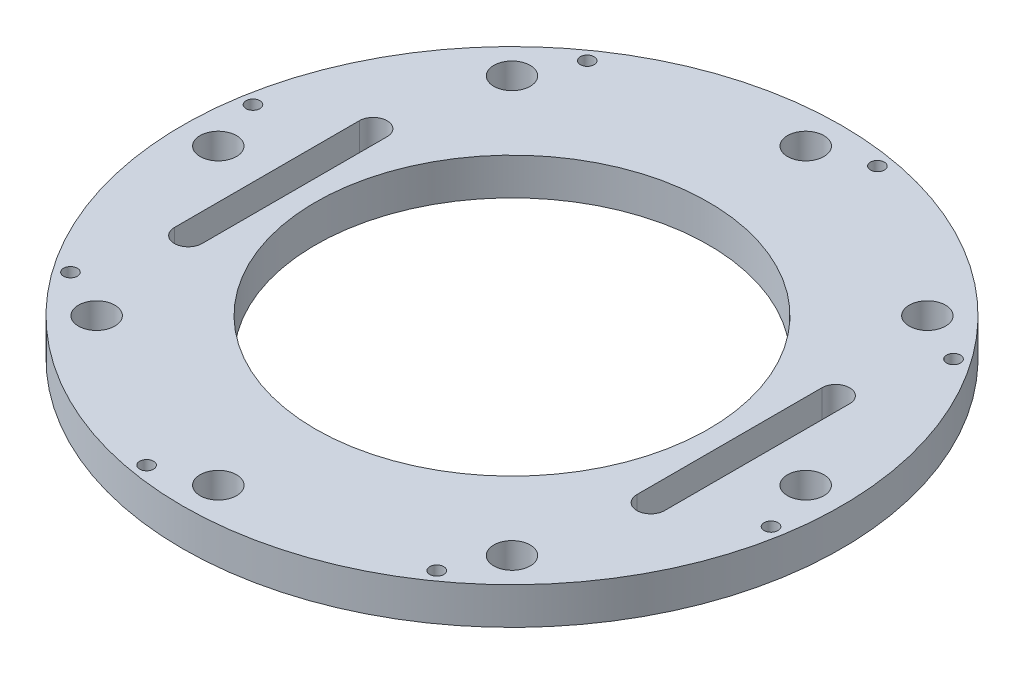
ISO-10303-21;
HEADER;
FILE_DESCRIPTION(('STEP AP214'),'2;1');
FILE_NAME('part.step','',(''),(''),'','','');
FILE_SCHEMA(('AUTOMOTIVE_DESIGN { 1 0 10303 214 1 1 1 1 }'));
ENDSEC;
DATA;
#1=APPLICATION_CONTEXT('core data for automotive mechanical design processes');
#2=APPLICATION_PROTOCOL_DEFINITION('international standard','automotive_design',2000,#1);
#3=PRODUCT_CONTEXT('',#1,'mechanical');
#4=PRODUCT('Part','Part','',(#3));
#5=PRODUCT_RELATED_PRODUCT_CATEGORY('part','',(#4));
#6=PRODUCT_DEFINITION_FORMATION('','',#4);
#7=PRODUCT_DEFINITION_CONTEXT('part definition',#1,'design');
#8=PRODUCT_DEFINITION('design','',#6,#7);
#9=PRODUCT_DEFINITION_SHAPE('','',#8);
#10=(LENGTH_UNIT() NAMED_UNIT(*) SI_UNIT(.MILLI.,.METRE.));
#11=(NAMED_UNIT(*) PLANE_ANGLE_UNIT() SI_UNIT($,.RADIAN.));
#12=(NAMED_UNIT(*) SI_UNIT($,.STERADIAN.) SOLID_ANGLE_UNIT());
#13=UNCERTAINTY_MEASURE_WITH_UNIT(LENGTH_MEASURE(1.E-05),#10,'distance_accuracy_value','');
#14=(GEOMETRIC_REPRESENTATION_CONTEXT(3) GLOBAL_UNCERTAINTY_ASSIGNED_CONTEXT((#13)) GLOBAL_UNIT_ASSIGNED_CONTEXT((#10,
#11,#12)) REPRESENTATION_CONTEXT('',''));
#15=CARTESIAN_POINT('',(0.,0.,0.));
#16=DIRECTION('',(0.,0.,1.));
#17=DIRECTION('',(1.,0.,0.));
#18=AXIS2_PLACEMENT_3D('',#15,#16,#17);
#19=CARTESIAN_POINT('',(-10.6,1.6,0.));
#20=DIRECTION('',(-1.,0.,0.));
#21=DIRECTION('',(0.,0.,1.));
#22=AXIS2_PLACEMENT_3D('',#19,#20,#21);
#23=PLANE('',#22);
#24=DIRECTION('',(0.,0.,-1.));
#25=VECTOR('',#24,1.);
#26=CARTESIAN_POINT('',(-10.6,0.,0.));
#27=LINE('',#26,#25);
#28=CARTESIAN_POINT('',(-10.6,0.,4.));
#29=VERTEX_POINT('',#28);
#30=CARTESIAN_POINT('',(-10.6,0.,-4.));
#31=VERTEX_POINT('',#30);
#32=EDGE_CURVE('E195',#29,#31,#27,.T.);
#33=ORIENTED_EDGE('',*,*,#32,.T.);
#34=DIRECTION('',(0.,-1.,0.));
#35=VECTOR('',#34,1.);
#36=CARTESIAN_POINT('',(-10.6,1.6,-4.));
#37=LINE('',#36,#35);
#38=CARTESIAN_POINT('',(-10.6,1.6,-4.));
#39=VERTEX_POINT('',#38);
#40=EDGE_CURVE('E11',#39,#31,#37,.T.);
#41=ORIENTED_EDGE('',*,*,#40,.F.);
#42=DIRECTION('',(0.,0.,-1.));
#43=VECTOR('',#42,1.);
#44=CARTESIAN_POINT('',(-10.6,1.6,0.));
#45=LINE('',#44,#43);
#46=CARTESIAN_POINT('',(-10.6,1.6,4.));
#47=VERTEX_POINT('',#46);
#48=EDGE_CURVE('E112',#47,#39,#45,.T.);
#49=ORIENTED_EDGE('',*,*,#48,.F.);
#50=DIRECTION('',(0.,-1.,0.));
#51=VECTOR('',#50,1.);
#52=CARTESIAN_POINT('',(-10.6,1.6,4.));
#53=LINE('',#52,#51);
#54=EDGE_CURVE('E203',#47,#29,#53,.T.);
#55=ORIENTED_EDGE('',*,*,#54,.T.);
#56=EDGE_LOOP('',(#33,#41,#49,#55));
#57=FACE_BOUND('',#56,.T.);
#58=ADVANCED_FACE('F35',(#57),#23,.F.);
#59=CARTESIAN_POINT('',(-10.,1.6,-4.));
#60=DIRECTION('',(0.,-1.,0.));
#61=DIRECTION('',(0.,0.,-1.));
#62=AXIS2_PLACEMENT_3D('',#59,#60,#61);
#63=CYLINDRICAL_SURFACE('',#62,0.6);
#64=CARTESIAN_POINT('',(-10.,0.,-4.));
#65=DIRECTION('',(0.,1.,0.));
#66=DIRECTION('',(0.,0.,1.));
#67=AXIS2_PLACEMENT_3D('',#64,#65,#66);
#68=CIRCLE('',#67,0.6);
#69=CARTESIAN_POINT('',(-9.4,0.,-4.));
#70=VERTEX_POINT('',#69);
#71=EDGE_CURVE('E118',#31,#70,#68,.F.);
#72=ORIENTED_EDGE('',*,*,#71,.T.);
#73=DIRECTION('',(0.,-1.,0.));
#74=VECTOR('',#73,1.);
#75=CARTESIAN_POINT('',(-9.4,1.6,-4.));
#76=LINE('',#75,#74);
#77=CARTESIAN_POINT('',(-9.4,1.6,-4.));
#78=VERTEX_POINT('',#77);
#79=EDGE_CURVE('E45',#78,#70,#76,.T.);
#80=ORIENTED_EDGE('',*,*,#79,.F.);
#81=CARTESIAN_POINT('',(-10.,1.6,-4.));
#82=DIRECTION('',(0.,1.,0.));
#83=DIRECTION('',(0.,0.,1.));
#84=AXIS2_PLACEMENT_3D('',#81,#82,#83);
#85=CIRCLE('',#84,0.6);
#86=EDGE_CURVE('E106',#39,#78,#85,.F.);
#87=ORIENTED_EDGE('',*,*,#86,.F.);
#88=ORIENTED_EDGE('',*,*,#40,.T.);
#89=EDGE_LOOP('',(#72,#80,#87,#88));
#90=FACE_BOUND('',#89,.T.);
#91=ADVANCED_FACE('F117',(#90),#63,.F.);
#92=CARTESIAN_POINT('',(-9.4,1.6,0.));
#93=DIRECTION('',(-1.,0.,0.));
#94=DIRECTION('',(0.,0.,1.));
#95=AXIS2_PLACEMENT_3D('',#92,#93,#94);
#96=PLANE('',#95);
#97=DIRECTION('',(0.,0.,-1.));
#98=VECTOR('',#97,1.);
#99=CARTESIAN_POINT('',(-9.4,0.,0.));
#100=LINE('',#99,#98);
#101=CARTESIAN_POINT('',(-9.4,0.,4.));
#102=VERTEX_POINT('',#101);
#103=EDGE_CURVE('E199',#102,#70,#100,.T.);
#104=ORIENTED_EDGE('',*,*,#103,.F.);
#105=DIRECTION('',(0.,-1.,0.));
#106=VECTOR('',#105,1.);
#107=CARTESIAN_POINT('',(-9.4,1.6,4.));
#108=LINE('',#107,#106);
#109=CARTESIAN_POINT('',(-9.4,1.6,4.));
#110=VERTEX_POINT('',#109);
#111=EDGE_CURVE('E82',#110,#102,#108,.T.);
#112=ORIENTED_EDGE('',*,*,#111,.F.);
#113=DIRECTION('',(0.,0.,-1.));
#114=VECTOR('',#113,1.);
#115=CARTESIAN_POINT('',(-9.4,1.6,0.));
#116=LINE('',#115,#114);
#117=EDGE_CURVE('E110',#110,#78,#116,.T.);
#118=ORIENTED_EDGE('',*,*,#117,.T.);
#119=ORIENTED_EDGE('',*,*,#79,.T.);
#120=EDGE_LOOP('',(#104,#112,#118,#119));
#121=FACE_BOUND('',#120,.T.);
#122=ADVANCED_FACE('F123',(#121),#96,.T.);
#123=CARTESIAN_POINT('',(10.,1.6,-4.));
#124=DIRECTION('',(0.,-1.,0.));
#125=DIRECTION('',(0.,0.,-1.));
#126=AXIS2_PLACEMENT_3D('',#123,#124,#125);
#127=CYLINDRICAL_SURFACE('',#126,0.6);
#128=CARTESIAN_POINT('',(10.,0.,-4.));
#129=DIRECTION('',(0.,1.,0.));
#130=DIRECTION('',(0.,0.,1.));
#131=AXIS2_PLACEMENT_3D('',#128,#129,#130);
#132=CIRCLE('',#131,0.6);
#133=CARTESIAN_POINT('',(10.6,0.,-4.));
#134=VERTEX_POINT('',#133);
#135=CARTESIAN_POINT('',(9.4,0.,-4.));
#136=VERTEX_POINT('',#135);
#137=EDGE_CURVE('E177',#134,#136,#132,.T.);
#138=ORIENTED_EDGE('',*,*,#137,.F.);
#139=DIRECTION('',(0.,-1.,0.));
#140=VECTOR('',#139,1.);
#141=CARTESIAN_POINT('',(10.6,1.6,-4.));
#142=LINE('',#141,#140);
#143=CARTESIAN_POINT('',(10.6,1.6,-4.));
#144=VERTEX_POINT('',#143);
#145=EDGE_CURVE('E39',#144,#134,#142,.T.);
#146=ORIENTED_EDGE('',*,*,#145,.F.);
#147=CARTESIAN_POINT('',(10.,1.6,-4.));
#148=DIRECTION('',(0.,1.,0.));
#149=DIRECTION('',(0.,0.,1.));
#150=AXIS2_PLACEMENT_3D('',#147,#148,#149);
#151=CIRCLE('',#150,0.6);
#152=CARTESIAN_POINT('',(9.4,1.6,-4.));
#153=VERTEX_POINT('',#152);
#154=EDGE_CURVE('E236',#144,#153,#151,.T.);
#155=ORIENTED_EDGE('',*,*,#154,.T.);
#156=DIRECTION('',(0.,-1.,0.));
#157=VECTOR('',#156,1.);
#158=CARTESIAN_POINT('',(9.4,1.6,-4.));
#159=LINE('',#158,#157);
#160=EDGE_CURVE('E125',#153,#136,#159,.T.);
#161=ORIENTED_EDGE('',*,*,#160,.T.);
#162=EDGE_LOOP('',(#138,#146,#155,#161));
#163=FACE_BOUND('',#162,.T.);
#164=ADVANCED_FACE('F218',(#163),#127,.F.);
#165=CARTESIAN_POINT('',(10.6,1.6,0.));
#166=DIRECTION('',(-1.,0.,0.));
#167=DIRECTION('',(0.,0.,1.));
#168=AXIS2_PLACEMENT_3D('',#165,#166,#167);
#169=PLANE('',#168);
#170=DIRECTION('',(0.,0.,-1.));
#171=VECTOR('',#170,1.);
#172=CARTESIAN_POINT('',(10.6,0.,0.));
#173=LINE('',#172,#171);
#174=CARTESIAN_POINT('',(10.6,0.,4.));
#175=VERTEX_POINT('',#174);
#176=EDGE_CURVE('E180',#175,#134,#173,.T.);
#177=ORIENTED_EDGE('',*,*,#176,.F.);
#178=DIRECTION('',(0.,-1.,0.));
#179=VECTOR('',#178,1.);
#180=CARTESIAN_POINT('',(10.6,1.6,4.));
#181=LINE('',#180,#179);
#182=CARTESIAN_POINT('',(10.6,1.6,4.));
#183=VERTEX_POINT('',#182);
#184=EDGE_CURVE('E208',#183,#175,#181,.T.);
#185=ORIENTED_EDGE('',*,*,#184,.F.);
#186=DIRECTION('',(0.,0.,-1.));
#187=VECTOR('',#186,1.);
#188=CARTESIAN_POINT('',(10.6,1.6,0.));
#189=LINE('',#188,#187);
#190=EDGE_CURVE('E217',#183,#144,#189,.T.);
#191=ORIENTED_EDGE('',*,*,#190,.T.);
#192=ORIENTED_EDGE('',*,*,#145,.T.);
#193=EDGE_LOOP('',(#177,#185,#191,#192));
#194=FACE_BOUND('',#193,.T.);
#195=ADVANCED_FACE('F215',(#194),#169,.T.);
#196=CARTESIAN_POINT('',(10.,1.6,4.));
#197=DIRECTION('',(0.,-1.,0.));
#198=DIRECTION('',(0.,0.,-1.));
#199=AXIS2_PLACEMENT_3D('',#196,#197,#198);
#200=CYLINDRICAL_SURFACE('',#199,0.6);
#201=CARTESIAN_POINT('',(10.,0.,4.));
#202=DIRECTION('',(0.,1.,0.));
#203=DIRECTION('',(0.,0.,1.));
#204=AXIS2_PLACEMENT_3D('',#201,#202,#203);
#205=CIRCLE('',#204,0.6);
#206=CARTESIAN_POINT('',(9.4,0.,4.));
#207=VERTEX_POINT('',#206);
#208=EDGE_CURVE('E183',#207,#175,#205,.T.);
#209=ORIENTED_EDGE('',*,*,#208,.F.);
#210=DIRECTION('',(0.,-1.,0.));
#211=VECTOR('',#210,1.);
#212=CARTESIAN_POINT('',(9.4,1.6,4.));
#213=LINE('',#212,#211);
#214=CARTESIAN_POINT('',(9.4,1.6,4.));
#215=VERTEX_POINT('',#214);
#216=EDGE_CURVE('E207',#215,#207,#213,.T.);
#217=ORIENTED_EDGE('',*,*,#216,.F.);
#218=CARTESIAN_POINT('',(10.,1.6,4.));
#219=DIRECTION('',(0.,1.,0.));
#220=DIRECTION('',(0.,0.,1.));
#221=AXIS2_PLACEMENT_3D('',#218,#219,#220);
#222=CIRCLE('',#221,0.6);
#223=EDGE_CURVE('E227',#215,#183,#222,.T.);
#224=ORIENTED_EDGE('',*,*,#223,.T.);
#225=ORIENTED_EDGE('',*,*,#184,.T.);
#226=EDGE_LOOP('',(#209,#217,#224,#225));
#227=FACE_BOUND('',#226,.T.);
#228=ADVANCED_FACE('F224',(#227),#200,.F.);
#229=CARTESIAN_POINT('',(0.,1.6,0.));
#230=DIRECTION('',(0.,-1.,0.));
#231=DIRECTION('',(0.,0.,-1.));
#232=AXIS2_PLACEMENT_3D('',#229,#230,#231);
#233=CYLINDRICAL_SURFACE('',#232,14.25);
#234=CARTESIAN_POINT('',(0.,1.6,0.));
#235=DIRECTION('',(0.,1.,0.));
#236=DIRECTION('',(0.,0.,1.));
#237=AXIS2_PLACEMENT_3D('',#234,#235,#236);
#238=CIRCLE('',#237,14.25);
#239=CARTESIAN_POINT('',(0.,1.6,14.25));
#240=VERTEX_POINT('',#239);
#241=EDGE_CURVE('E242',#240,#240,#238,.T.);
#242=ORIENTED_EDGE('',*,*,#241,.F.);
#243=EDGE_LOOP('',(#242));
#244=FACE_BOUND('',#243,.T.);
#245=CARTESIAN_POINT('',(0.,0.,0.));
#246=DIRECTION('',(0.,1.,0.));
#247=DIRECTION('',(0.,0.,1.));
#248=AXIS2_PLACEMENT_3D('',#245,#246,#247);
#249=CIRCLE('',#248,14.25);
#250=CARTESIAN_POINT('',(0.,0.,14.25));
#251=VERTEX_POINT('',#250);
#252=EDGE_CURVE('E192',#251,#251,#249,.T.);
#253=ORIENTED_EDGE('',*,*,#252,.T.);
#254=EDGE_LOOP('',(#253));
#255=FACE_BOUND('',#254,.T.);
#256=ADVANCED_FACE('F247',(#244,#255),#233,.T.);
#257=CARTESIAN_POINT('',(0.,1.6,0.));
#258=DIRECTION('',(0.,-1.,0.));
#259=DIRECTION('',(0.,0.,-1.));
#260=AXIS2_PLACEMENT_3D('',#257,#258,#259);
#261=CYLINDRICAL_SURFACE('',#260,8.5);
#262=CARTESIAN_POINT('',(0.,1.6,0.));
#263=DIRECTION('',(0.,1.,0.));
#264=DIRECTION('',(0.,0.,1.));
#265=AXIS2_PLACEMENT_3D('',#262,#263,#264);
#266=CIRCLE('',#265,8.5);
#267=CARTESIAN_POINT('',(0.,1.6,8.5));
#268=VERTEX_POINT('',#267);
#269=EDGE_CURVE('E232',#268,#268,#266,.T.);
#270=ORIENTED_EDGE('',*,*,#269,.T.);
#271=EDGE_LOOP('',(#270));
#272=FACE_BOUND('',#271,.T.);
#273=CARTESIAN_POINT('',(0.,0.,0.));
#274=DIRECTION('',(0.,1.,0.));
#275=DIRECTION('',(0.,0.,1.));
#276=AXIS2_PLACEMENT_3D('',#273,#274,#275);
#277=CIRCLE('',#276,8.5);
#278=CARTESIAN_POINT('',(0.,0.,8.5));
#279=VERTEX_POINT('',#278);
#280=EDGE_CURVE('E189',#279,#279,#277,.T.);
#281=ORIENTED_EDGE('',*,*,#280,.F.);
#282=EDGE_LOOP('',(#281));
#283=FACE_BOUND('',#282,.T.);
#284=ADVANCED_FACE('F250',(#272,#283),#261,.F.);
#285=CARTESIAN_POINT('',(9.4,1.6,0.));
#286=DIRECTION('',(-1.,0.,0.));
#287=DIRECTION('',(0.,0.,1.));
#288=AXIS2_PLACEMENT_3D('',#285,#286,#287);
#289=PLANE('',#288);
#290=DIRECTION('',(0.,0.,-1.));
#291=VECTOR('',#290,1.);
#292=CARTESIAN_POINT('',(9.4,0.,0.));
#293=LINE('',#292,#291);
#294=EDGE_CURVE('E186',#207,#136,#293,.T.);
#295=ORIENTED_EDGE('',*,*,#294,.T.);
#296=ORIENTED_EDGE('',*,*,#160,.F.);
#297=DIRECTION('',(0.,0.,-1.));
#298=VECTOR('',#297,1.);
#299=CARTESIAN_POINT('',(9.4,1.6,0.));
#300=LINE('',#299,#298);
#301=EDGE_CURVE('E229',#215,#153,#300,.T.);
#302=ORIENTED_EDGE('',*,*,#301,.F.);
#303=ORIENTED_EDGE('',*,*,#216,.T.);
#304=EDGE_LOOP('',(#295,#296,#302,#303));
#305=FACE_BOUND('',#304,.T.);
#306=ADVANCED_FACE('F230',(#305),#289,.F.);
#307=CARTESIAN_POINT('',(-8.98025612106917,1.6,8.98025612106914));
#308=DIRECTION('',(0.,-1.,0.));
#309=DIRECTION('',(0.,0.,-1.));
#310=AXIS2_PLACEMENT_3D('',#307,#308,#309);
#311=CYLINDRICAL_SURFACE('',#310,0.7874);
#312=CARTESIAN_POINT('',(-8.98025612106917,1.6,8.98025612106914));
#313=DIRECTION('',(0.,1.,0.));
#314=DIRECTION('',(0.,0.,1.));
#315=AXIS2_PLACEMENT_3D('',#312,#313,#314);
#316=CIRCLE('',#315,0.7874);
#317=CARTESIAN_POINT('',(-8.98025612106917,1.6,9.76765612106914));
#318=VERTEX_POINT('',#317);
#319=EDGE_CURVE('E441',#318,#318,#316,.T.);
#320=ORIENTED_EDGE('',*,*,#319,.T.);
#321=EDGE_LOOP('',(#320));
#322=FACE_BOUND('',#321,.T.);
#323=CARTESIAN_POINT('',(-8.98025612106917,0.,8.98025612106914));
#324=DIRECTION('',(0.,1.,0.));
#325=DIRECTION('',(0.,0.,1.));
#326=AXIS2_PLACEMENT_3D('',#323,#324,#325);
#327=CIRCLE('',#326,0.7874);
#328=CARTESIAN_POINT('',(-8.98025612106917,0.,9.76765612106914));
#329=VERTEX_POINT('',#328);
#330=EDGE_CURVE('E174',#329,#329,#327,.T.);
#331=ORIENTED_EDGE('',*,*,#330,.F.);
#332=EDGE_LOOP('',(#331));
#333=FACE_BOUND('',#332,.T.);
#334=ADVANCED_FACE('F284',(#322,#333),#311,.F.);
#335=CARTESIAN_POINT('',(-12.7,1.6,0.));
#336=DIRECTION('',(0.,-1.,0.));
#337=DIRECTION('',(0.,0.,-1.));
#338=AXIS2_PLACEMENT_3D('',#335,#336,#337);
#339=CYLINDRICAL_SURFACE('',#338,0.787399999999999);
#340=CARTESIAN_POINT('',(-12.7,1.6,0.));
#341=DIRECTION('',(0.,1.,0.));
#342=DIRECTION('',(0.,0.,1.));
#343=AXIS2_PLACEMENT_3D('',#340,#341,#342);
#344=CIRCLE('',#343,0.787399999999999);
#345=CARTESIAN_POINT('',(-12.7,1.6,0.787399999999955));
#346=VERTEX_POINT('',#345);
#347=EDGE_CURVE('E438',#346,#346,#344,.T.);
#348=ORIENTED_EDGE('',*,*,#347,.T.);
#349=EDGE_LOOP('',(#348));
#350=FACE_BOUND('',#349,.T.);
#351=CARTESIAN_POINT('',(-12.7,0.,0.));
#352=DIRECTION('',(0.,1.,0.));
#353=DIRECTION('',(0.,0.,1.));
#354=AXIS2_PLACEMENT_3D('',#351,#352,#353);
#355=CIRCLE('',#354,0.787399999999999);
#356=CARTESIAN_POINT('',(-12.7,0.,0.787399999999955));
#357=VERTEX_POINT('',#356);
#358=EDGE_CURVE('E171',#357,#357,#355,.T.);
#359=ORIENTED_EDGE('',*,*,#358,.F.);
#360=EDGE_LOOP('',(#359));
#361=FACE_BOUND('',#360,.T.);
#362=ADVANCED_FACE('F293',(#350,#361),#339,.F.);
#363=CARTESIAN_POINT('',(-8.98025612106911,1.6,-8.9802561210692));
#364=DIRECTION('',(0.,-1.,0.));
#365=DIRECTION('',(0.,0.,-1.));
#366=AXIS2_PLACEMENT_3D('',#363,#364,#365);
#367=CYLINDRICAL_SURFACE('',#366,0.7874);
#368=CARTESIAN_POINT('',(-8.98025612106911,1.6,-8.9802561210692));
#369=DIRECTION('',(0.,1.,0.));
#370=DIRECTION('',(0.,0.,1.));
#371=AXIS2_PLACEMENT_3D('',#368,#369,#370);
#372=CIRCLE('',#371,0.7874);
#373=CARTESIAN_POINT('',(-8.98025612106911,1.6,-8.1928561210692));
#374=VERTEX_POINT('',#373);
#375=EDGE_CURVE('E435',#374,#374,#372,.T.);
#376=ORIENTED_EDGE('',*,*,#375,.T.);
#377=EDGE_LOOP('',(#376));
#378=FACE_BOUND('',#377,.T.);
#379=CARTESIAN_POINT('',(-8.98025612106911,0.,-8.9802561210692));
#380=DIRECTION('',(0.,1.,0.));
#381=DIRECTION('',(0.,0.,1.));
#382=AXIS2_PLACEMENT_3D('',#379,#380,#381);
#383=CIRCLE('',#382,0.7874);
#384=CARTESIAN_POINT('',(-8.98025612106911,0.,-8.1928561210692));
#385=VERTEX_POINT('',#384);
#386=EDGE_CURVE('E168',#385,#385,#383,.T.);
#387=ORIENTED_EDGE('',*,*,#386,.F.);
#388=EDGE_LOOP('',(#387));
#389=FACE_BOUND('',#388,.T.);
#390=ADVANCED_FACE('F297',(#378,#389),#367,.F.);
#391=CARTESIAN_POINT('',(0.,1.6,-12.7));
#392=DIRECTION('',(0.,-1.,0.));
#393=DIRECTION('',(0.,0.,-1.));
#394=AXIS2_PLACEMENT_3D('',#391,#392,#393);
#395=CYLINDRICAL_SURFACE('',#394,0.7874);
#396=CARTESIAN_POINT('',(0.,1.6,-12.7));
#397=DIRECTION('',(0.,1.,0.));
#398=DIRECTION('',(0.,0.,1.));
#399=AXIS2_PLACEMENT_3D('',#396,#397,#398);
#400=CIRCLE('',#399,0.7874);
#401=CARTESIAN_POINT('',(0.,1.6,-11.9126));
#402=VERTEX_POINT('',#401);
#403=EDGE_CURVE('E432',#402,#402,#400,.T.);
#404=ORIENTED_EDGE('',*,*,#403,.T.);
#405=EDGE_LOOP('',(#404));
#406=FACE_BOUND('',#405,.T.);
#407=CARTESIAN_POINT('',(0.,0.,-12.7));
#408=DIRECTION('',(0.,1.,0.));
#409=DIRECTION('',(0.,0.,1.));
#410=AXIS2_PLACEMENT_3D('',#407,#408,#409);
#411=CIRCLE('',#410,0.7874);
#412=CARTESIAN_POINT('',(0.,0.,-11.9126));
#413=VERTEX_POINT('',#412);
#414=EDGE_CURVE('E165',#413,#413,#411,.T.);
#415=ORIENTED_EDGE('',*,*,#414,.F.);
#416=EDGE_LOOP('',(#415));
#417=FACE_BOUND('',#416,.T.);
#418=ADVANCED_FACE('F301',(#406,#417),#395,.F.);
#419=CARTESIAN_POINT('',(8.98025612106924,1.6,-8.98025612106908));
#420=DIRECTION('',(0.,-1.,0.));
#421=DIRECTION('',(0.,0.,-1.));
#422=AXIS2_PLACEMENT_3D('',#419,#420,#421);
#423=CYLINDRICAL_SURFACE('',#422,0.787399999999999);
#424=CARTESIAN_POINT('',(8.98025612106924,1.6,-8.98025612106908));
#425=DIRECTION('',(0.,1.,0.));
#426=DIRECTION('',(0.,0.,1.));
#427=AXIS2_PLACEMENT_3D('',#424,#425,#426);
#428=CIRCLE('',#427,0.787399999999999);
#429=CARTESIAN_POINT('',(8.98025612106924,1.6,-8.19285612106908));
#430=VERTEX_POINT('',#429);
#431=EDGE_CURVE('E429',#430,#430,#428,.T.);
#432=ORIENTED_EDGE('',*,*,#431,.T.);
#433=EDGE_LOOP('',(#432));
#434=FACE_BOUND('',#433,.T.);
#435=CARTESIAN_POINT('',(8.98025612106924,0.,-8.98025612106908));
#436=DIRECTION('',(0.,1.,0.));
#437=DIRECTION('',(0.,0.,1.));
#438=AXIS2_PLACEMENT_3D('',#435,#436,#437);
#439=CIRCLE('',#438,0.787399999999999);
#440=CARTESIAN_POINT('',(8.98025612106924,0.,-8.19285612106908));
#441=VERTEX_POINT('',#440);
#442=EDGE_CURVE('E162',#441,#441,#439,.T.);
#443=ORIENTED_EDGE('',*,*,#442,.F.);
#444=EDGE_LOOP('',(#443));
#445=FACE_BOUND('',#444,.T.);
#446=ADVANCED_FACE('F305',(#434,#445),#423,.F.);
#447=CARTESIAN_POINT('',(12.7,1.6,1.33025439009923E-13));
#448=DIRECTION('',(0.,-1.,0.));
#449=DIRECTION('',(0.,0.,-1.));
#450=AXIS2_PLACEMENT_3D('',#447,#448,#449);
#451=CYLINDRICAL_SURFACE('',#450,0.787399999999999);
#452=CARTESIAN_POINT('',(12.7,1.6,1.33025439009923E-13));
#453=DIRECTION('',(0.,1.,0.));
#454=DIRECTION('',(0.,0.,1.));
#455=AXIS2_PLACEMENT_3D('',#452,#453,#454);
#456=CIRCLE('',#455,0.787399999999999);
#457=CARTESIAN_POINT('',(12.7,1.6,0.787400000000132));
#458=VERTEX_POINT('',#457);
#459=EDGE_CURVE('E426',#458,#458,#456,.T.);
#460=ORIENTED_EDGE('',*,*,#459,.T.);
#461=EDGE_LOOP('',(#460));
#462=FACE_BOUND('',#461,.T.);
#463=CARTESIAN_POINT('',(12.7,0.,1.33025439009923E-13));
#464=DIRECTION('',(0.,1.,0.));
#465=DIRECTION('',(0.,0.,1.));
#466=AXIS2_PLACEMENT_3D('',#463,#464,#465);
#467=CIRCLE('',#466,0.787399999999999);
#468=CARTESIAN_POINT('',(12.7,0.,0.787400000000132));
#469=VERTEX_POINT('',#468);
#470=EDGE_CURVE('E159',#469,#469,#467,.T.);
#471=ORIENTED_EDGE('',*,*,#470,.F.);
#472=EDGE_LOOP('',(#471));
#473=FACE_BOUND('',#472,.T.);
#474=ADVANCED_FACE('F309',(#462,#473),#451,.F.);
#475=CARTESIAN_POINT('',(8.98025612106905,1.6,8.98025612106927));
#476=DIRECTION('',(0.,-1.,0.));
#477=DIRECTION('',(0.,0.,-1.));
#478=AXIS2_PLACEMENT_3D('',#475,#476,#477);
#479=CYLINDRICAL_SURFACE('',#478,0.7874);
#480=CARTESIAN_POINT('',(8.98025612106905,1.6,8.98025612106927));
#481=DIRECTION('',(0.,1.,0.));
#482=DIRECTION('',(0.,0.,1.));
#483=AXIS2_PLACEMENT_3D('',#480,#481,#482);
#484=CIRCLE('',#483,0.7874);
#485=CARTESIAN_POINT('',(8.98025612106905,1.6,9.76765612106926));
#486=VERTEX_POINT('',#485);
#487=EDGE_CURVE('E423',#486,#486,#484,.T.);
#488=ORIENTED_EDGE('',*,*,#487,.T.);
#489=EDGE_LOOP('',(#488));
#490=FACE_BOUND('',#489,.T.);
#491=CARTESIAN_POINT('',(8.98025612106905,0.,8.98025612106927));
#492=DIRECTION('',(0.,1.,0.));
#493=DIRECTION('',(0.,0.,1.));
#494=AXIS2_PLACEMENT_3D('',#491,#492,#493);
#495=CIRCLE('',#494,0.7874);
#496=CARTESIAN_POINT('',(8.98025612106905,0.,9.76765612106926));
#497=VERTEX_POINT('',#496);
#498=EDGE_CURVE('E156',#497,#497,#495,.T.);
#499=ORIENTED_EDGE('',*,*,#498,.F.);
#500=EDGE_LOOP('',(#499));
#501=FACE_BOUND('',#500,.T.);
#502=ADVANCED_FACE('F313',(#490,#501),#479,.F.);
#503=CARTESIAN_POINT('',(0.,1.6,12.7));
#504=DIRECTION('',(0.,-1.,0.));
#505=DIRECTION('',(0.,0.,-1.));
#506=AXIS2_PLACEMENT_3D('',#503,#504,#505);
#507=CYLINDRICAL_SURFACE('',#506,0.7874);
#508=CARTESIAN_POINT('',(0.,1.6,12.7));
#509=DIRECTION('',(0.,1.,0.));
#510=DIRECTION('',(0.,0.,1.));
#511=AXIS2_PLACEMENT_3D('',#508,#509,#510);
#512=CIRCLE('',#511,0.7874);
#513=CARTESIAN_POINT('',(0.,1.6,13.4874));
#514=VERTEX_POINT('',#513);
#515=EDGE_CURVE('E420',#514,#514,#512,.T.);
#516=ORIENTED_EDGE('',*,*,#515,.T.);
#517=EDGE_LOOP('',(#516));
#518=FACE_BOUND('',#517,.T.);
#519=CARTESIAN_POINT('',(0.,0.,12.7));
#520=DIRECTION('',(0.,1.,0.));
#521=DIRECTION('',(0.,0.,1.));
#522=AXIS2_PLACEMENT_3D('',#519,#520,#521);
#523=CIRCLE('',#522,0.7874);
#524=CARTESIAN_POINT('',(0.,0.,13.4874));
#525=VERTEX_POINT('',#524);
#526=EDGE_CURVE('E153',#525,#525,#523,.T.);
#527=ORIENTED_EDGE('',*,*,#526,.F.);
#528=EDGE_LOOP('',(#527));
#529=FACE_BOUND('',#528,.T.);
#530=ADVANCED_FACE('F317',(#518,#529),#507,.F.);
#531=CARTESIAN_POINT('',(-13.5,1.6,-2.3));
#532=DIRECTION('',(0.,-1.,0.));
#533=DIRECTION('',(0.,0.,-1.));
#534=AXIS2_PLACEMENT_3D('',#531,#532,#533);
#535=CYLINDRICAL_SURFACE('',#534,0.3);
#536=CARTESIAN_POINT('',(-13.5,1.6,-2.3));
#537=DIRECTION('',(0.,1.,0.));
#538=DIRECTION('',(0.,0.,1.));
#539=AXIS2_PLACEMENT_3D('',#536,#537,#538);
#540=CIRCLE('',#539,0.3);
#541=CARTESIAN_POINT('',(-13.5,1.6,-2.));
#542=VERTEX_POINT('',#541);
#543=EDGE_CURVE('E417',#542,#542,#540,.T.);
#544=ORIENTED_EDGE('',*,*,#543,.T.);
#545=EDGE_LOOP('',(#544));
#546=FACE_BOUND('',#545,.T.);
#547=CARTESIAN_POINT('',(-13.5,0.,-2.3));
#548=DIRECTION('',(0.,1.,0.));
#549=DIRECTION('',(0.,0.,1.));
#550=AXIS2_PLACEMENT_3D('',#547,#548,#549);
#551=CIRCLE('',#550,0.3);
#552=CARTESIAN_POINT('',(-13.5,0.,-2.));
#553=VERTEX_POINT('',#552);
#554=EDGE_CURVE('E150',#553,#553,#551,.T.);
#555=ORIENTED_EDGE('',*,*,#554,.F.);
#556=EDGE_LOOP('',(#555));
#557=FACE_BOUND('',#556,.T.);
#558=ADVANCED_FACE('F321',(#546,#557),#535,.F.);
#559=CARTESIAN_POINT('',(-7.91959594928971,1.6,-11.1722871427477));
#560=DIRECTION('',(0.,-1.,0.));
#561=DIRECTION('',(0.,0.,-1.));
#562=AXIS2_PLACEMENT_3D('',#559,#560,#561);
#563=CYLINDRICAL_SURFACE('',#562,0.300000000000459);
#564=CARTESIAN_POINT('',(-7.91959594928971,1.6,-11.1722871427477));
#565=DIRECTION('',(0.,1.,0.));
#566=DIRECTION('',(0.,0.,1.));
#567=AXIS2_PLACEMENT_3D('',#564,#565,#566);
#568=CIRCLE('',#567,0.300000000000459);
#569=CARTESIAN_POINT('',(-7.91959594928971,1.6,-10.8722871427472));
#570=VERTEX_POINT('',#569);
#571=EDGE_CURVE('E414',#570,#570,#568,.T.);
#572=ORIENTED_EDGE('',*,*,#571,.T.);
#573=EDGE_LOOP('',(#572));
#574=FACE_BOUND('',#573,.T.);
#575=CARTESIAN_POINT('',(-7.91959594928971,0.,-11.1722871427477));
#576=DIRECTION('',(0.,1.,0.));
#577=DIRECTION('',(0.,0.,1.));
#578=AXIS2_PLACEMENT_3D('',#575,#576,#577);
#579=CIRCLE('',#578,0.300000000000459);
#580=CARTESIAN_POINT('',(-7.91959594928971,0.,-10.8722871427472));
#581=VERTEX_POINT('',#580);
#582=EDGE_CURVE('E147',#581,#581,#579,.T.);
#583=ORIENTED_EDGE('',*,*,#582,.F.);
#584=EDGE_LOOP('',(#583));
#585=FACE_BOUND('',#584,.T.);
#586=ADVANCED_FACE('F325',(#574,#585),#563,.F.);
#587=CARTESIAN_POINT('',(2.29999999999952,1.6,-13.5000000000007));
#588=DIRECTION('',(0.,-1.,0.));
#589=DIRECTION('',(0.,0.,-1.));
#590=AXIS2_PLACEMENT_3D('',#587,#588,#589);
#591=CYLINDRICAL_SURFACE('',#590,0.300000000000808);
#592=CARTESIAN_POINT('',(2.29999999999952,1.6,-13.5000000000007));
#593=DIRECTION('',(0.,1.,0.));
#594=DIRECTION('',(0.,0.,1.));
#595=AXIS2_PLACEMENT_3D('',#592,#593,#594);
#596=CIRCLE('',#595,0.300000000000808);
#597=CARTESIAN_POINT('',(2.29999999999952,1.6,-13.1999999999999));
#598=VERTEX_POINT('',#597);
#599=EDGE_CURVE('E411',#598,#598,#596,.T.);
#600=ORIENTED_EDGE('',*,*,#599,.T.);
#601=EDGE_LOOP('',(#600));
#602=FACE_BOUND('',#601,.T.);
#603=CARTESIAN_POINT('',(2.29999999999952,0.,-13.5000000000007));
#604=DIRECTION('',(0.,1.,0.));
#605=DIRECTION('',(0.,0.,1.));
#606=AXIS2_PLACEMENT_3D('',#603,#604,#605);
#607=CIRCLE('',#606,0.300000000000808);
#608=CARTESIAN_POINT('',(2.29999999999952,0.,-13.1999999999999));
#609=VERTEX_POINT('',#608);
#610=EDGE_CURVE('E144',#609,#609,#607,.T.);
#611=ORIENTED_EDGE('',*,*,#610,.F.);
#612=EDGE_LOOP('',(#611));
#613=FACE_BOUND('',#612,.T.);
#614=ADVANCED_FACE('F329',(#602,#613),#591,.F.);
#615=CARTESIAN_POINT('',(11.1722871427472,1.6,-7.91959594929039));
#616=DIRECTION('',(0.,-1.,0.));
#617=DIRECTION('',(0.,0.,-1.));
#618=AXIS2_PLACEMENT_3D('',#615,#616,#617);
#619=CYLINDRICAL_SURFACE('',#618,0.300000000000856);
#620=CARTESIAN_POINT('',(11.1722871427472,1.6,-7.91959594929039));
#621=DIRECTION('',(0.,1.,0.));
#622=DIRECTION('',(0.,0.,1.));
#623=AXIS2_PLACEMENT_3D('',#620,#621,#622);
#624=CIRCLE('',#623,0.300000000000856);
#625=CARTESIAN_POINT('',(11.1722871427472,1.6,-7.61959594928953));
#626=VERTEX_POINT('',#625);
#627=EDGE_CURVE('E408',#626,#626,#624,.T.);
#628=ORIENTED_EDGE('',*,*,#627,.T.);
#629=EDGE_LOOP('',(#628));
#630=FACE_BOUND('',#629,.T.);
#631=CARTESIAN_POINT('',(11.1722871427472,0.,-7.91959594929039));
#632=DIRECTION('',(0.,1.,0.));
#633=DIRECTION('',(0.,0.,1.));
#634=AXIS2_PLACEMENT_3D('',#631,#632,#633);
#635=CIRCLE('',#634,0.300000000000856);
#636=CARTESIAN_POINT('',(11.1722871427472,0.,-7.61959594928953));
#637=VERTEX_POINT('',#636);
#638=EDGE_CURVE('E141',#637,#637,#635,.T.);
#639=ORIENTED_EDGE('',*,*,#638,.F.);
#640=EDGE_LOOP('',(#639));
#641=FACE_BOUND('',#640,.T.);
#642=ADVANCED_FACE('F333',(#630,#641),#619,.F.);
#643=CARTESIAN_POINT('',(13.5000000000002,1.6,2.29999999999885));
#644=DIRECTION('',(0.,-1.,0.));
#645=DIRECTION('',(0.,0.,-1.));
#646=AXIS2_PLACEMENT_3D('',#643,#644,#645);
#647=CYLINDRICAL_SURFACE('',#646,0.30000000000057);
#648=CARTESIAN_POINT('',(13.5000000000002,1.6,2.29999999999885));
#649=DIRECTION('',(0.,1.,0.));
#650=DIRECTION('',(0.,0.,1.));
#651=AXIS2_PLACEMENT_3D('',#648,#649,#650);
#652=CIRCLE('',#651,0.30000000000057);
#653=CARTESIAN_POINT('',(13.5000000000002,1.6,2.59999999999942));
#654=VERTEX_POINT('',#653);
#655=EDGE_CURVE('E401',#654,#654,#652,.T.);
#656=ORIENTED_EDGE('',*,*,#655,.T.);
#657=EDGE_LOOP('',(#656));
#658=FACE_BOUND('',#657,.T.);
#659=CARTESIAN_POINT('',(13.5000000000002,0.,2.29999999999885));
#660=DIRECTION('',(0.,1.,0.));
#661=DIRECTION('',(0.,0.,1.));
#662=AXIS2_PLACEMENT_3D('',#659,#660,#661);
#663=CIRCLE('',#662,0.30000000000057);
#664=CARTESIAN_POINT('',(13.5000000000002,0.,2.59999999999942));
#665=VERTEX_POINT('',#664);
#666=EDGE_CURVE('E138',#665,#665,#663,.T.);
#667=ORIENTED_EDGE('',*,*,#666,.F.);
#668=EDGE_LOOP('',(#667));
#669=FACE_BOUND('',#668,.T.);
#670=ADVANCED_FACE('F337',(#658,#669),#647,.F.);
#671=CARTESIAN_POINT('',(7.91959594928991,1.6,11.1722871427465));
#672=DIRECTION('',(0.,-1.,0.));
#673=DIRECTION('',(0.,0.,-1.));
#674=AXIS2_PLACEMENT_3D('',#671,#672,#673);
#675=CYLINDRICAL_SURFACE('',#674,0.300000000000143);
#676=CARTESIAN_POINT('',(7.91959594928991,1.6,11.1722871427465));
#677=DIRECTION('',(0.,1.,0.));
#678=DIRECTION('',(0.,0.,1.));
#679=AXIS2_PLACEMENT_3D('',#676,#677,#678);
#680=CIRCLE('',#679,0.300000000000143);
#681=CARTESIAN_POINT('',(7.91959594928991,1.6,11.4722871427467));
#682=VERTEX_POINT('',#681);
#683=EDGE_CURVE('E398',#682,#682,#680,.T.);
#684=ORIENTED_EDGE('',*,*,#683,.T.);
#685=EDGE_LOOP('',(#684));
#686=FACE_BOUND('',#685,.T.);
#687=CARTESIAN_POINT('',(7.91959594928991,0.,11.1722871427465));
#688=DIRECTION('',(0.,1.,0.));
#689=DIRECTION('',(0.,0.,1.));
#690=AXIS2_PLACEMENT_3D('',#687,#688,#689);
#691=CIRCLE('',#690,0.300000000000143);
#692=CARTESIAN_POINT('',(7.91959594928991,0.,11.4722871427467));
#693=VERTEX_POINT('',#692);
#694=EDGE_CURVE('E135',#693,#693,#691,.T.);
#695=ORIENTED_EDGE('',*,*,#694,.F.);
#696=EDGE_LOOP('',(#695));
#697=FACE_BOUND('',#696,.T.);
#698=ADVANCED_FACE('F341',(#686,#697),#675,.F.);
#699=CARTESIAN_POINT('',(-2.29999999999932,1.6,13.4999999999995));
#700=DIRECTION('',(0.,-1.,0.));
#701=DIRECTION('',(0.,0.,-1.));
#702=AXIS2_PLACEMENT_3D('',#699,#700,#701);
#703=CYLINDRICAL_SURFACE('',#702,0.299999999999809);
#704=CARTESIAN_POINT('',(-2.29999999999932,1.6,13.4999999999995));
#705=DIRECTION('',(0.,1.,0.));
#706=DIRECTION('',(0.,0.,1.));
#707=AXIS2_PLACEMENT_3D('',#704,#705,#706);
#708=CIRCLE('',#707,0.299999999999809);
#709=CARTESIAN_POINT('',(-2.29999999999932,1.6,13.7999999999993));
#710=VERTEX_POINT('',#709);
#711=EDGE_CURVE('E352',#710,#710,#708,.T.);
#712=ORIENTED_EDGE('',*,*,#711,.T.);
#713=EDGE_LOOP('',(#712));
#714=FACE_BOUND('',#713,.T.);
#715=CARTESIAN_POINT('',(-2.29999999999932,0.,13.4999999999995));
#716=DIRECTION('',(0.,1.,0.));
#717=DIRECTION('',(0.,0.,1.));
#718=AXIS2_PLACEMENT_3D('',#715,#716,#717);
#719=CIRCLE('',#718,0.299999999999809);
#720=CARTESIAN_POINT('',(-2.29999999999932,0.,13.7999999999993));
#721=VERTEX_POINT('',#720);
#722=EDGE_CURVE('E132',#721,#721,#719,.T.);
#723=ORIENTED_EDGE('',*,*,#722,.F.);
#724=EDGE_LOOP('',(#723));
#725=FACE_BOUND('',#724,.T.);
#726=ADVANCED_FACE('F269',(#714,#725),#703,.F.);
#727=CARTESIAN_POINT('',(-11.172287142747,1.6,7.91959594928924));
#728=DIRECTION('',(0.,-1.,0.));
#729=DIRECTION('',(0.,0.,-1.));
#730=AXIS2_PLACEMENT_3D('',#727,#728,#729);
#731=CYLINDRICAL_SURFACE('',#730,0.299999999999789);
#732=CARTESIAN_POINT('',(-11.172287142747,1.6,7.91959594928924));
#733=DIRECTION('',(0.,1.,0.));
#734=DIRECTION('',(0.,0.,1.));
#735=AXIS2_PLACEMENT_3D('',#732,#733,#734);
#736=CIRCLE('',#735,0.299999999999789);
#737=CARTESIAN_POINT('',(-11.172287142747,1.6,8.21959594928903));
#738=VERTEX_POINT('',#737);
#739=EDGE_CURVE('E202',#738,#738,#736,.T.);
#740=ORIENTED_EDGE('',*,*,#739,.T.);
#741=EDGE_LOOP('',(#740));
#742=FACE_BOUND('',#741,.T.);
#743=CARTESIAN_POINT('',(-11.172287142747,0.,7.91959594928924));
#744=DIRECTION('',(0.,1.,0.));
#745=DIRECTION('',(0.,0.,1.));
#746=AXIS2_PLACEMENT_3D('',#743,#744,#745);
#747=CIRCLE('',#746,0.299999999999789);
#748=CARTESIAN_POINT('',(-11.172287142747,0.,8.21959594928903));
#749=VERTEX_POINT('',#748);
#750=EDGE_CURVE('E129',#749,#749,#747,.T.);
#751=ORIENTED_EDGE('',*,*,#750,.F.);
#752=EDGE_LOOP('',(#751));
#753=FACE_BOUND('',#752,.T.);
#754=ADVANCED_FACE('F37',(#742,#753),#731,.F.);
#755=CARTESIAN_POINT('',(-10.,1.6,4.));
#756=DIRECTION('',(0.,-1.,0.));
#757=DIRECTION('',(0.,0.,-1.));
#758=AXIS2_PLACEMENT_3D('',#755,#756,#757);
#759=CYLINDRICAL_SURFACE('',#758,0.6);
#760=CARTESIAN_POINT('',(-10.,0.,4.));
#761=DIRECTION('',(0.,1.,0.));
#762=DIRECTION('',(0.,0.,1.));
#763=AXIS2_PLACEMENT_3D('',#760,#761,#762);
#764=CIRCLE('',#763,0.6);
#765=EDGE_CURVE('E85',#102,#29,#764,.F.);
#766=ORIENTED_EDGE('',*,*,#765,.T.);
#767=ORIENTED_EDGE('',*,*,#54,.F.);
#768=CARTESIAN_POINT('',(-10.,1.6,4.));
#769=DIRECTION('',(0.,1.,0.));
#770=DIRECTION('',(0.,0.,1.));
#771=AXIS2_PLACEMENT_3D('',#768,#769,#770);
#772=CIRCLE('',#771,0.6);
#773=EDGE_CURVE('E54',#110,#47,#772,.F.);
#774=ORIENTED_EDGE('',*,*,#773,.F.);
#775=ORIENTED_EDGE('',*,*,#111,.T.);
#776=EDGE_LOOP('',(#766,#767,#774,#775));
#777=FACE_BOUND('',#776,.T.);
#778=ADVANCED_FACE('F260',(#777),#759,.F.);
#779=CARTESIAN_POINT('',(0.,1.6,0.));
#780=DIRECTION('',(0.,1.,0.));
#781=DIRECTION('',(0.,0.,1.));
#782=AXIS2_PLACEMENT_3D('',#779,#780,#781);
#783=PLANE('',#782);
#784=ORIENTED_EDGE('',*,*,#739,.F.);
#785=EDGE_LOOP('',(#784));
#786=FACE_BOUND('',#785,.T.);
#787=ORIENTED_EDGE('',*,*,#711,.F.);
#788=EDGE_LOOP('',(#787));
#789=FACE_BOUND('',#788,.T.);
#790=ORIENTED_EDGE('',*,*,#683,.F.);
#791=EDGE_LOOP('',(#790));
#792=FACE_BOUND('',#791,.T.);
#793=ORIENTED_EDGE('',*,*,#655,.F.);
#794=EDGE_LOOP('',(#793));
#795=FACE_BOUND('',#794,.T.);
#796=ORIENTED_EDGE('',*,*,#627,.F.);
#797=EDGE_LOOP('',(#796));
#798=FACE_BOUND('',#797,.T.);
#799=ORIENTED_EDGE('',*,*,#599,.F.);
#800=EDGE_LOOP('',(#799));
#801=FACE_BOUND('',#800,.T.);
#802=ORIENTED_EDGE('',*,*,#571,.F.);
#803=EDGE_LOOP('',(#802));
#804=FACE_BOUND('',#803,.T.);
#805=ORIENTED_EDGE('',*,*,#543,.F.);
#806=EDGE_LOOP('',(#805));
#807=FACE_BOUND('',#806,.T.);
#808=ORIENTED_EDGE('',*,*,#515,.F.);
#809=EDGE_LOOP('',(#808));
#810=FACE_BOUND('',#809,.T.);
#811=ORIENTED_EDGE('',*,*,#487,.F.);
#812=EDGE_LOOP('',(#811));
#813=FACE_BOUND('',#812,.T.);
#814=ORIENTED_EDGE('',*,*,#459,.F.);
#815=EDGE_LOOP('',(#814));
#816=FACE_BOUND('',#815,.T.);
#817=ORIENTED_EDGE('',*,*,#431,.F.);
#818=EDGE_LOOP('',(#817));
#819=FACE_BOUND('',#818,.T.);
#820=ORIENTED_EDGE('',*,*,#403,.F.);
#821=EDGE_LOOP('',(#820));
#822=FACE_BOUND('',#821,.T.);
#823=ORIENTED_EDGE('',*,*,#375,.F.);
#824=EDGE_LOOP('',(#823));
#825=FACE_BOUND('',#824,.T.);
#826=ORIENTED_EDGE('',*,*,#347,.F.);
#827=EDGE_LOOP('',(#826));
#828=FACE_BOUND('',#827,.T.);
#829=ORIENTED_EDGE('',*,*,#319,.F.);
#830=EDGE_LOOP('',(#829));
#831=FACE_BOUND('',#830,.T.);
#832=ORIENTED_EDGE('',*,*,#154,.F.);
#833=ORIENTED_EDGE('',*,*,#190,.F.);
#834=ORIENTED_EDGE('',*,*,#223,.F.);
#835=ORIENTED_EDGE('',*,*,#301,.T.);
#836=EDGE_LOOP('',(#832,#833,#834,#835));
#837=FACE_BOUND('',#836,.T.);
#838=ORIENTED_EDGE('',*,*,#269,.F.);
#839=EDGE_LOOP('',(#838));
#840=FACE_BOUND('',#839,.T.);
#841=ORIENTED_EDGE('',*,*,#241,.T.);
#842=EDGE_LOOP('',(#841));
#843=FACE_BOUND('',#842,.T.);
#844=ORIENTED_EDGE('',*,*,#48,.T.);
#845=ORIENTED_EDGE('',*,*,#86,.T.);
#846=ORIENTED_EDGE('',*,*,#117,.F.);
#847=ORIENTED_EDGE('',*,*,#773,.T.);
#848=EDGE_LOOP('',(#844,#845,#846,#847));
#849=FACE_BOUND('',#848,.T.);
#850=ADVANCED_FACE('F108',(#786,#789,#792,#795,#798,#801,#804,#807,#810,#813,#816,#819,#822,
#825,#828,#831,#837,#840,#843,#849),#783,.T.);
#851=CARTESIAN_POINT('',(0.,0.,0.));
#852=DIRECTION('',(0.,1.,0.));
#853=DIRECTION('',(0.,0.,1.));
#854=AXIS2_PLACEMENT_3D('',#851,#852,#853);
#855=PLANE('',#854);
#856=ORIENTED_EDGE('',*,*,#750,.T.);
#857=EDGE_LOOP('',(#856));
#858=FACE_BOUND('',#857,.T.);
#859=ORIENTED_EDGE('',*,*,#722,.T.);
#860=EDGE_LOOP('',(#859));
#861=FACE_BOUND('',#860,.T.);
#862=ORIENTED_EDGE('',*,*,#694,.T.);
#863=EDGE_LOOP('',(#862));
#864=FACE_BOUND('',#863,.T.);
#865=ORIENTED_EDGE('',*,*,#666,.T.);
#866=EDGE_LOOP('',(#865));
#867=FACE_BOUND('',#866,.T.);
#868=ORIENTED_EDGE('',*,*,#638,.T.);
#869=EDGE_LOOP('',(#868));
#870=FACE_BOUND('',#869,.T.);
#871=ORIENTED_EDGE('',*,*,#610,.T.);
#872=EDGE_LOOP('',(#871));
#873=FACE_BOUND('',#872,.T.);
#874=ORIENTED_EDGE('',*,*,#582,.T.);
#875=EDGE_LOOP('',(#874));
#876=FACE_BOUND('',#875,.T.);
#877=ORIENTED_EDGE('',*,*,#554,.T.);
#878=EDGE_LOOP('',(#877));
#879=FACE_BOUND('',#878,.T.);
#880=ORIENTED_EDGE('',*,*,#526,.T.);
#881=EDGE_LOOP('',(#880));
#882=FACE_BOUND('',#881,.T.);
#883=ORIENTED_EDGE('',*,*,#498,.T.);
#884=EDGE_LOOP('',(#883));
#885=FACE_BOUND('',#884,.T.);
#886=ORIENTED_EDGE('',*,*,#470,.T.);
#887=EDGE_LOOP('',(#886));
#888=FACE_BOUND('',#887,.T.);
#889=ORIENTED_EDGE('',*,*,#442,.T.);
#890=EDGE_LOOP('',(#889));
#891=FACE_BOUND('',#890,.T.);
#892=ORIENTED_EDGE('',*,*,#414,.T.);
#893=EDGE_LOOP('',(#892));
#894=FACE_BOUND('',#893,.T.);
#895=ORIENTED_EDGE('',*,*,#386,.T.);
#896=EDGE_LOOP('',(#895));
#897=FACE_BOUND('',#896,.T.);
#898=ORIENTED_EDGE('',*,*,#358,.T.);
#899=EDGE_LOOP('',(#898));
#900=FACE_BOUND('',#899,.T.);
#901=ORIENTED_EDGE('',*,*,#330,.T.);
#902=EDGE_LOOP('',(#901));
#903=FACE_BOUND('',#902,.T.);
#904=ORIENTED_EDGE('',*,*,#137,.T.);
#905=ORIENTED_EDGE('',*,*,#294,.F.);
#906=ORIENTED_EDGE('',*,*,#208,.T.);
#907=ORIENTED_EDGE('',*,*,#176,.T.);
#908=EDGE_LOOP('',(#904,#905,#906,#907));
#909=FACE_BOUND('',#908,.T.);
#910=ORIENTED_EDGE('',*,*,#280,.T.);
#911=EDGE_LOOP('',(#910));
#912=FACE_BOUND('',#911,.T.);
#913=ORIENTED_EDGE('',*,*,#252,.F.);
#914=EDGE_LOOP('',(#913));
#915=FACE_BOUND('',#914,.T.);
#916=ORIENTED_EDGE('',*,*,#32,.F.);
#917=ORIENTED_EDGE('',*,*,#765,.F.);
#918=ORIENTED_EDGE('',*,*,#103,.T.);
#919=ORIENTED_EDGE('',*,*,#71,.F.);
#920=EDGE_LOOP('',(#916,#917,#918,#919));
#921=FACE_BOUND('',#920,.T.);
#922=ADVANCED_FACE('F222',(#858,#861,#864,#867,#870,#873,#876,#879,#882,#885,#888,#891,#894,
#897,#900,#903,#909,#912,#915,#921),#855,.F.);
#923=CLOSED_SHELL('',(#58,#91,#122,#164,#195,#228,#256,#284,#306,#334,#362,#390,#418,#446,#474,
#502,#530,#558,#586,#614,#642,#670,#698,#726,#754,#778,#850,#922));
#924=MANIFOLD_SOLID_BREP('B2',#923);
#925=ADVANCED_BREP_SHAPE_REPRESENTATION('',(#18,#924),#14);
#926=SHAPE_DEFINITION_REPRESENTATION(#9,#925);
ENDSEC;
END-ISO-10303-21;
